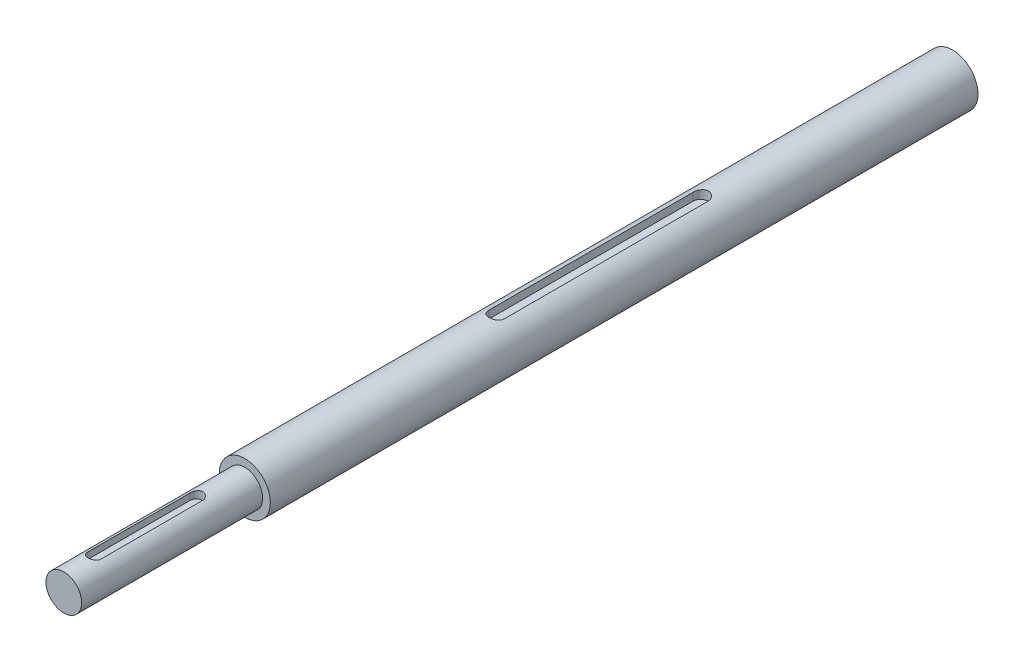
ISO-10303-21;
HEADER;
FILE_DESCRIPTION(('STEP AP214'),'2;1');
FILE_NAME('part.step','',(''),(''),'','','');
FILE_SCHEMA(('AUTOMOTIVE_DESIGN { 1 0 10303 214 1 1 1 1 }'));
ENDSEC;
DATA;
#1=APPLICATION_CONTEXT('core data for automotive mechanical design processes');
#2=APPLICATION_PROTOCOL_DEFINITION('international standard','automotive_design',2000,#1);
#3=PRODUCT_CONTEXT('',#1,'mechanical');
#4=PRODUCT('Part','Part','',(#3));
#5=PRODUCT_RELATED_PRODUCT_CATEGORY('part','',(#4));
#6=PRODUCT_DEFINITION_FORMATION('','',#4);
#7=PRODUCT_DEFINITION_CONTEXT('part definition',#1,'design');
#8=PRODUCT_DEFINITION('design','',#6,#7);
#9=PRODUCT_DEFINITION_SHAPE('','',#8);
#10=(LENGTH_UNIT() NAMED_UNIT(*) SI_UNIT(.MILLI.,.METRE.));
#11=(NAMED_UNIT(*) PLANE_ANGLE_UNIT() SI_UNIT($,.RADIAN.));
#12=(NAMED_UNIT(*) SI_UNIT($,.STERADIAN.) SOLID_ANGLE_UNIT());
#13=UNCERTAINTY_MEASURE_WITH_UNIT(LENGTH_MEASURE(1.E-05),#10,'distance_accuracy_value','');
#14=(GEOMETRIC_REPRESENTATION_CONTEXT(3) GLOBAL_UNCERTAINTY_ASSIGNED_CONTEXT((#13)) GLOBAL_UNIT_ASSIGNED_CONTEXT((#10,
#11,#12)) REPRESENTATION_CONTEXT('',''));
#15=CARTESIAN_POINT('',(0.,0.,0.));
#16=DIRECTION('',(0.,0.,1.));
#17=DIRECTION('',(1.,0.,0.));
#18=AXIS2_PLACEMENT_3D('',#15,#16,#17);
#19=CARTESIAN_POINT('',(0.,0.,138.8));
#20=DIRECTION('',(0.,0.,-1.));
#21=DIRECTION('',(-1.,0.,0.));
#22=AXIS2_PLACEMENT_3D('',#19,#20,#21);
#23=CYLINDRICAL_SURFACE('',#22,10.);
#24=DIRECTION('',(0.,0.,-1.));
#25=VECTOR('',#24,1.);
#26=CARTESIAN_POINT('',(-2.99999999999999,9.53939201416946,138.8));
#27=LINE('',#26,#25);
#28=CARTESIAN_POINT('',(-3.,9.53939201416946,40.));
#29=VERTEX_POINT('',#28);
#30=CARTESIAN_POINT('',(-3.00000000000001,9.53939201416945,-40.));
#31=VERTEX_POINT('',#30);
#32=EDGE_CURVE('E11',#29,#31,#27,.T.);
#33=ORIENTED_EDGE('',*,*,#32,.T.);
#34=CARTESIAN_POINT('',(-3.00000000000001,9.53939201416945,-40.));
#35=CARTESIAN_POINT('',(-3.00001027845729,9.53938054248206,-40.0823355208227));
#36=CARTESIAN_POINT('',(-2.99661062684474,9.54045772064378,-40.1646644550632));
#37=CARTESIAN_POINT('',(-2.98307142899348,9.54470412105985,-40.3286939527655));
#38=CARTESIAN_POINT('',(-2.9729333980542,9.54787287296848,-40.4103946533244));
#39=CARTESIAN_POINT('',(-2.94603140625046,9.55620668351002,-40.5723849156732));
#40=CARTESIAN_POINT('',(-2.92928426957738,9.56136667250114,-40.652677524043));
#41=CARTESIAN_POINT('',(-2.88932853030396,9.57351626651178,-40.8114758441342));
#42=CARTESIAN_POINT('',(-2.86611975872642,9.58050591937827,-40.8899815090674));
#43=CARTESIAN_POINT('',(-2.78708584446026,9.60391637654136,-41.1219493879901));
#44=CARTESIAN_POINT('',(-2.72181852542974,9.6227900783039,-41.272068438833));
#45=CARTESIAN_POINT('',(-2.56815043531277,9.66493213967819,-41.559226043979));
#46=CARTESIAN_POINT('',(-2.47973889924161,9.6882025429064,-41.6962584707622));
#47=CARTESIAN_POINT('',(-2.27929879634444,9.73733650515374,-41.9577229879478));
#48=CARTESIAN_POINT('',(-2.16666914746585,9.76325505469873,-42.0816848740609));
#49=CARTESIAN_POINT('',(-1.92227736150435,9.81429628475076,-42.3092736148388));
#50=CARTESIAN_POINT('',(-1.79051199848165,9.83941883019409,-42.412897033861));
#51=CARTESIAN_POINT('',(-1.50821997465698,9.88666477976534,-42.5989268650946));
#52=CARTESIAN_POINT('',(-1.35736167401017,9.90871541546877,-42.6808501797826));
#53=CARTESIAN_POINT('',(-1.04324233568304,9.94668940088144,-42.8179770040029));
#54=CARTESIAN_POINT('',(-0.879984508687998,9.96261433032402,-42.873187403368));
#55=CARTESIAN_POINT('',(-0.550649404820614,9.98615279768397,-42.953759551791));
#56=CARTESIAN_POINT('',(-0.384786253016216,9.99399098526792,-42.9799297035176));
#57=CARTESIAN_POINT('',(-0.0508471415689416,10.0012640407204,-43.004234695146));
#58=CARTESIAN_POINT('',(0.117228393125325,10.0007004995012,-43.0023748426782));
#59=CARTESIAN_POINT('',(0.44514319927181,9.99139205125586,-42.9712141793086));
#60=CARTESIAN_POINT('',(0.605074290763014,9.98290831016512,-42.9427893091919));
#61=CARTESIAN_POINT('',(0.9177801043703,9.95903027401822,-42.8607367303745));
#62=CARTESIAN_POINT('',(1.07055445110878,9.94363561692558,-42.8071077013173));
#63=CARTESIAN_POINT('',(1.3666956317391,9.90730429851782,-42.6755755564752));
#64=CARTESIAN_POINT('',(1.50993201207611,9.88630511384915,-42.5973967112239));
#65=CARTESIAN_POINT('',(1.78153105916099,9.84099249303647,-42.4192028199656));
#66=CARTESIAN_POINT('',(1.90989038323249,9.81667831471806,-42.3191828810593));
#67=CARTESIAN_POINT('',(2.15330901082204,9.7662334714278,-42.0956160238154));
#68=CARTESIAN_POINT('',(2.26766702955974,9.74006890899097,-41.9713122724738));
#69=CARTESIAN_POINT('',(2.47413538985065,9.68968430229327,-41.7050051531489));
#70=CARTESIAN_POINT('',(2.56623924026179,9.66546482675134,-41.5629966392702));
#71=CARTESIAN_POINT('',(2.726328144817,9.62154457591303,-41.2634381431001));
#72=CARTESIAN_POINT('',(2.79406012682261,9.60189192491895,-41.1057456408129));
#73=CARTESIAN_POINT('',(2.90171772009403,9.56991327306402,-40.7805509920369));
#74=CARTESIAN_POINT('',(2.94168586436071,9.5575760695175,-40.6130642785713));
#75=CARTESIAN_POINT('',(2.97802407180157,9.54628064650012,-40.3700102218596));
#76=CARTESIAN_POINT('',(2.98626405978016,9.54370312550534,-40.2962185316408));
#77=CARTESIAN_POINT('',(2.99724711229707,9.54025857223565,-40.148297041801));
#78=CARTESIAN_POINT('',(2.99999825936536,9.53938902493288,-40.0741679006723));
#79=CARTESIAN_POINT('',(2.99999999999999,9.53939201416946,-40.));
#80=B_SPLINE_CURVE_WITH_KNOTS('',3,(#34,#35,#36,#37,#38,#39,#40,#41,#42,#43,#44,#45,#46,#47,#48,
#49,#50,#51,#52,#53,#54,#55,#56,#57,#58,#59,#60,#61,#62,#63,#64,#65,#66,#67,#68,#69,#70,#71,#72,
#73,#74,#75,#76,#77,#78,#79),.UNSPECIFIED.,.F.,.F.,(4,2,2,2,2,2,2,2,2,2,2,2,2,2,2,2,2,2,2,2,2,2,
4),(0.,0.246918142439474,0.493780777706094,0.74001900962302,0.986263681482027,1.47813347402026,
1.97023245590779,2.47635119822766,2.98255536239032,3.4992281062007,4.01576751791672,
4.51753600864764,5.01920948804101,5.50490358251093,5.99062312360831,6.48200583350621,
6.9734987373917,7.48389234847122,7.99443465298715,8.51013494368214,9.02504345105574,
9.24774267716779,9.47011372732391),.UNSPECIFIED.);
#81=CARTESIAN_POINT('',(2.99999999999999,9.53939201416945,-40.));
#82=VERTEX_POINT('',#81);
#83=EDGE_CURVE('E323',#31,#82,#80,.T.);
#84=ORIENTED_EDGE('',*,*,#83,.T.);
#85=DIRECTION('',(0.,0.,-1.));
#86=VECTOR('',#85,1.);
#87=CARTESIAN_POINT('',(3.00000000000001,9.53939201416945,138.8));
#88=LINE('',#87,#86);
#89=CARTESIAN_POINT('',(3.00000000000001,9.53939201416945,40.));
#90=VERTEX_POINT('',#89);
#91=EDGE_CURVE('E45',#82,#90,#88,.F.);
#92=ORIENTED_EDGE('',*,*,#91,.T.);
#93=CARTESIAN_POINT('',(3.,9.53939201416945,40.));
#94=CARTESIAN_POINT('',(3.00001027845728,9.53938054248206,40.0823355208227));
#95=CARTESIAN_POINT('',(2.99661062684472,9.54045772064378,40.1646644550632));
#96=CARTESIAN_POINT('',(2.98307142899347,9.54470412105986,40.3286939527655));
#97=CARTESIAN_POINT('',(2.97293339805418,9.54787287296848,40.4103946533244));
#98=CARTESIAN_POINT('',(2.94603140625045,9.55620668351003,40.5723849156732));
#99=CARTESIAN_POINT('',(2.92928426957737,9.56136667250114,40.652677524043));
#100=CARTESIAN_POINT('',(2.88932853030395,9.57351626651178,40.8114758441342));
#101=CARTESIAN_POINT('',(2.8661197587264,9.58050591937827,40.8899815090674));
#102=CARTESIAN_POINT('',(2.78708584446024,9.60391637654136,41.1219493879901));
#103=CARTESIAN_POINT('',(2.72181852542972,9.6227900783039,41.272068438833));
#104=CARTESIAN_POINT('',(2.56815043531275,9.66493213967819,41.559226043979));
#105=CARTESIAN_POINT('',(2.47973889924159,9.68820254290641,41.6962584707622));
#106=CARTESIAN_POINT('',(2.27929879634442,9.73733650515374,41.9577229879478));
#107=CARTESIAN_POINT('',(2.16666914746584,9.76325505469874,42.0816848740609));
#108=CARTESIAN_POINT('',(1.92227736150433,9.81429628475077,42.3092736148388));
#109=CARTESIAN_POINT('',(1.79051199848164,9.8394188301941,42.412897033861));
#110=CARTESIAN_POINT('',(1.50821997465697,9.88666477976534,42.5989268650946));
#111=CARTESIAN_POINT('',(1.35736167401016,9.90871541546877,42.6808501797826));
#112=CARTESIAN_POINT('',(1.04324233568303,9.94668940088144,42.8179770040029));
#113=CARTESIAN_POINT('',(0.879984508687983,9.96261433032402,42.873187403368));
#114=CARTESIAN_POINT('',(0.550649404820599,9.98615279768397,42.953759551791));
#115=CARTESIAN_POINT('',(0.384786253016201,9.99399098526792,42.9799297035176));
#116=CARTESIAN_POINT('',(0.0508471415689265,10.0012640407204,43.004234695146));
#117=CARTESIAN_POINT('',(-0.11722839312534,10.0007004995012,43.0023748426782));
#118=CARTESIAN_POINT('',(-0.445143199271825,9.99139205125586,42.9712141793086));
#119=CARTESIAN_POINT('',(-0.605074290763029,9.98290831016512,42.9427893091919));
#120=CARTESIAN_POINT('',(-0.917780104370315,9.95903027401822,42.8607367303745));
#121=CARTESIAN_POINT('',(-1.07055445110879,9.94363561692558,42.8071077013173));
#122=CARTESIAN_POINT('',(-1.36669563173912,9.90730429851782,42.6755755564752));
#123=CARTESIAN_POINT('',(-1.50993201207613,9.88630511384914,42.5973967112239));
#124=CARTESIAN_POINT('',(-1.781531059161,9.84099249303646,42.4192028199656));
#125=CARTESIAN_POINT('',(-1.90989038323251,9.81667831471806,42.3191828810593));
#126=CARTESIAN_POINT('',(-2.15330901082206,9.7662334714278,42.0956160238154));
#127=CARTESIAN_POINT('',(-2.26766702955976,9.74006890899097,41.9713122724738));
#128=CARTESIAN_POINT('',(-2.47413538985067,9.68968430229327,41.7050051531489));
#129=CARTESIAN_POINT('',(-2.5662392402618,9.66546482675133,41.5629966392702));
#130=CARTESIAN_POINT('',(-2.72632814481701,9.62154457591303,41.2634381431001));
#131=CARTESIAN_POINT('',(-2.79406012682263,9.60189192491895,41.1057456408129));
#132=CARTESIAN_POINT('',(-2.90171772009404,9.56991327306402,40.7805509920369));
#133=CARTESIAN_POINT('',(-2.94168586436072,9.55757606951749,40.6130642785713));
#134=CARTESIAN_POINT('',(-2.97802407180159,9.54628064650011,40.3700102218596));
#135=CARTESIAN_POINT('',(-2.98626405978017,9.54370312550533,40.2962185316408));
#136=CARTESIAN_POINT('',(-2.99724711229709,9.54025857223564,40.148297041801));
#137=CARTESIAN_POINT('',(-2.99999825936538,9.53938902493288,40.0741679006723));
#138=CARTESIAN_POINT('',(-3.,9.53939201416945,40.));
#139=B_SPLINE_CURVE_WITH_KNOTS('',3,(#93,#94,#95,#96,#97,#98,#99,#100,#101,#102,#103,#104,#105,
#106,#107,#108,#109,#110,#111,#112,#113,#114,#115,#116,#117,#118,#119,#120,#121,#122,#123,#124,
#125,#126,#127,#128,#129,#130,#131,#132,#133,#134,#135,#136,#137,#138),.UNSPECIFIED.,.F.,.F.,(4,
2,2,2,2,2,2,2,2,2,2,2,2,2,2,2,2,2,2,2,2,2,4),(0.,0.246918142439474,0.493780777706094,
0.74001900962302,0.986263681482027,1.47813347402026,1.97023245590779,2.47635119822766,
2.98255536239032,3.4992281062007,4.01576751791672,4.51753600864764,5.01920948804101,
5.50490358251093,5.99062312360831,6.48200583350621,6.9734987373917,7.48389234847122,
7.99443465298715,8.51013494368214,9.02504345105574,9.24774267716779,9.47011372732391),.UNSPECIFIED.);
#140=EDGE_CURVE('E52',#90,#29,#139,.T.);
#141=ORIENTED_EDGE('',*,*,#140,.T.);
#142=EDGE_LOOP('',(#33,#84,#92,#141));
#143=FACE_BOUND('',#142,.T.);
#144=CARTESIAN_POINT('',(0.,0.,138.8));
#145=DIRECTION('',(0.,0.,1.));
#146=DIRECTION('',(1.,0.,0.));
#147=AXIS2_PLACEMENT_3D('',#144,#145,#146);
#148=CIRCLE('',#147,10.);
#149=CARTESIAN_POINT('',(10.,0.,138.8));
#150=VERTEX_POINT('',#149);
#151=EDGE_CURVE('E164',#150,#150,#148,.T.);
#152=ORIENTED_EDGE('',*,*,#151,.F.);
#153=EDGE_LOOP('',(#152));
#154=FACE_BOUND('',#153,.T.);
#155=CARTESIAN_POINT('',(0.,0.,-138.8));
#156=DIRECTION('',(0.,0.,1.));
#157=DIRECTION('',(1.,0.,0.));
#158=AXIS2_PLACEMENT_3D('',#155,#156,#157);
#159=CIRCLE('',#158,10.);
#160=CARTESIAN_POINT('',(10.,0.,-138.8));
#161=VERTEX_POINT('',#160);
#162=EDGE_CURVE('E159',#161,#161,#159,.T.);
#163=ORIENTED_EDGE('',*,*,#162,.T.);
#164=EDGE_LOOP('',(#163));
#165=FACE_BOUND('',#164,.T.);
#166=ADVANCED_FACE('F37',(#143,#154,#165),#23,.T.);
#167=CARTESIAN_POINT('',(0.,0.,138.8));
#168=DIRECTION('',(0.,0.,1.));
#169=DIRECTION('',(1.,0.,0.));
#170=AXIS2_PLACEMENT_3D('',#167,#168,#169);
#171=PLANE('',#170);
#172=CARTESIAN_POINT('',(0.,0.,138.8));
#173=DIRECTION('',(0.,0.,1.));
#174=DIRECTION('',(1.,0.,0.));
#175=AXIS2_PLACEMENT_3D('',#172,#173,#174);
#176=CIRCLE('',#175,7.);
#177=CARTESIAN_POINT('',(7.,0.,138.8));
#178=VERTEX_POINT('',#177);
#179=EDGE_CURVE('E160',#178,#178,#176,.T.);
#180=ORIENTED_EDGE('',*,*,#179,.F.);
#181=EDGE_LOOP('',(#180));
#182=FACE_BOUND('',#181,.T.);
#183=ORIENTED_EDGE('',*,*,#151,.T.);
#184=EDGE_LOOP('',(#183));
#185=FACE_BOUND('',#184,.T.);
#186=ADVANCED_FACE('F211',(#182,#185),#171,.T.);
#187=CARTESIAN_POINT('',(0.,0.,-138.8));
#188=DIRECTION('',(0.,0.,1.));
#189=DIRECTION('',(1.,0.,0.));
#190=AXIS2_PLACEMENT_3D('',#187,#188,#189);
#191=PLANE('',#190);
#192=ORIENTED_EDGE('',*,*,#162,.F.);
#193=EDGE_LOOP('',(#192));
#194=FACE_BOUND('',#193,.T.);
#195=ADVANCED_FACE('F208',(#194),#191,.F.);
#196=CARTESIAN_POINT('',(0.,0.,209.8));
#197=DIRECTION('',(0.,0.,-1.));
#198=DIRECTION('',(-1.,0.,0.));
#199=AXIS2_PLACEMENT_3D('',#196,#197,#198);
#200=CYLINDRICAL_SURFACE('',#199,7.);
#201=DIRECTION('',(0.,0.,-1.));
#202=VECTOR('',#201,1.);
#203=CARTESIAN_POINT('',(-2.5,6.53834841531101,209.8));
#204=LINE('',#203,#202);
#205=CARTESIAN_POINT('',(-2.5,6.53834841531101,197.8));
#206=VERTEX_POINT('',#205);
#207=CARTESIAN_POINT('',(-2.5,6.53834841531101,157.8));
#208=VERTEX_POINT('',#207);
#209=EDGE_CURVE('E330',#206,#208,#204,.T.);
#210=ORIENTED_EDGE('',*,*,#209,.T.);
#211=CARTESIAN_POINT('',(-2.5,6.53834841531101,157.8));
#212=CARTESIAN_POINT('',(-2.50000932220903,6.53833653785133,157.732110754271));
#213=CARTESIAN_POINT('',(-2.49723485076694,6.53940549922738,157.664228067361));
#214=CARTESIAN_POINT('',(-2.4861910211816,6.54361657478134,157.528996089389));
#215=CARTESIAN_POINT('',(-2.47792334551208,6.54675805418062,157.461646641394));
#216=CARTESIAN_POINT('',(-2.456001752859,6.55501217637942,157.328178585397));
#217=CARTESIAN_POINT('',(-2.44236559963954,6.56011831705676,157.26205666366));
#218=CARTESIAN_POINT('',(-2.40985115466648,6.57213177854175,157.131298164891));
#219=CARTESIAN_POINT('',(-2.39097263107436,6.57903917900746,157.066661653688));
#220=CARTESIAN_POINT('',(-2.32673964179205,6.60214934365709,156.875735633522));
#221=CARTESIAN_POINT('',(-2.27375112606987,6.62075475340844,156.752209547864));
#222=CARTESIAN_POINT('',(-2.14910757865426,6.6622539736071,156.515769666872));
#223=CARTESIAN_POINT('',(-2.0774389504885,6.68515090424876,156.402863683264));
#224=CARTESIAN_POINT('',(-1.9140257110197,6.73379913792224,156.185784786647));
#225=CARTESIAN_POINT('',(-1.82158337146744,6.75962864041371,156.082153524804));
#226=CARTESIAN_POINT('',(-1.62073388776331,6.8105759232303,155.891491295284));
#227=CARTESIAN_POINT('',(-1.51232377552674,6.83569357019868,155.804463420757));
#228=CARTESIAN_POINT('',(-1.27853915335936,6.88331133279046,155.646910144545));
#229=CARTESIAN_POINT('',(-1.15274833789187,6.90570835223796,155.576968478139));
#230=CARTESIAN_POINT('',(-0.890250825476652,6.94442357672633,155.459463353203));
#231=CARTESIAN_POINT('',(-0.753547890540343,6.96074386585465,155.411892220954));
#232=CARTESIAN_POINT('',(-0.47882997925619,6.9849105051071,155.342359397818));
#233=CARTESIAN_POINT('',(-0.341079835227481,6.99306594352515,155.319460869529));
#234=CARTESIAN_POINT('',(-0.0634643052969175,7.00108798053822,155.296931597222));
#235=CARTESIAN_POINT('',(0.0764004845074357,7.00095687302702,155.297294413965));
#236=CARTESIAN_POINT('',(0.347593258486933,6.99262258049077,155.320711273761));
#237=CARTESIAN_POINT('',(0.479022407078707,6.98478243583517,155.342744794199));
#238=CARTESIAN_POINT('',(0.736175812143594,6.96237832507347,155.407173424159));
#239=CARTESIAN_POINT('',(0.861899745780453,6.94781397899037,155.449569684362));
#240=CARTESIAN_POINT('',(1.10616102429806,6.91316506890369,155.554046911565));
#241=CARTESIAN_POINT('',(1.22457279066905,6.89300592164314,155.61639571496));
#242=CARTESIAN_POINT('',(1.44953531305522,6.84923355616321,155.758779335223));
#243=CARTESIAN_POINT('',(1.55608245176769,6.82561928959263,155.838819523784));
#244=CARTESIAN_POINT('',(1.76032445256068,6.7759054780549,156.019323263657));
#245=CARTESIAN_POINT('',(1.85724185700416,6.74974055843876,156.120649723145));
#246=CARTESIAN_POINT('',(2.03299914621295,6.69890342468976,156.338327364166));
#247=CARTESIAN_POINT('',(2.11183255456461,6.67423174765257,156.454683905168));
#248=CARTESIAN_POINT('',(2.25049860898458,6.62877803875405,156.701942598522));
#249=CARTESIAN_POINT('',(2.30994207989624,6.60807875118995,156.833078975505));
#250=CARTESIAN_POINT('',(2.40555439725849,6.57388213610267,157.104364801582));
#251=CARTESIAN_POINT('',(2.44176119399953,6.56037307165054,157.244499141169));
#252=CARTESIAN_POINT('',(2.47705497148627,6.54708542245562,157.455030544264));
#253=CARTESIAN_POINT('',(2.48565347586445,6.54382010967907,157.523736301772));
#254=CARTESIAN_POINT('',(2.49712352174882,6.53944910829676,157.661615164192));
#255=CARTESIAN_POINT('',(2.50000139665368,6.53834103140935,157.7307876671));
#256=CARTESIAN_POINT('',(2.5,6.53834841531101,157.8));
#257=B_SPLINE_CURVE_WITH_KNOTS('',3,(#211,#212,#213,#214,#215,#216,#217,#218,#219,#220,#221,
#222,#223,#224,#225,#226,#227,#228,#229,#230,#231,#232,#233,#234,#235,#236,#237,#238,#239,#240,
#241,#242,#243,#244,#245,#246,#247,#248,#249,#250,#251,#252,#253,#254,#255,#256),.UNSPECIFIED.,
.F.,.F.,(4,2,2,2,2,2,2,2,2,2,2,2,2,2,2,2,2,2,2,2,2,2,4),(0.,0.203591628551585,0.407120929225507,
0.609982356545756,0.812852756635974,1.21793118555509,1.62330528148469,2.04515972311928,
2.46709267811838,2.90188398965559,3.33652604665236,3.7540099394086,4.17137826416921,
4.56998920861346,4.96862268086886,5.37284909448638,5.7771984136792,6.20315837945085,
6.62927065674716,7.06347329058501,7.49696496492443,7.70468580162773,7.91217653896406),.UNSPECIFIED.);
#258=CARTESIAN_POINT('',(2.5,6.53834841531101,157.8));
#259=VERTEX_POINT('',#258);
#260=EDGE_CURVE('E163',#208,#259,#257,.T.);
#261=ORIENTED_EDGE('',*,*,#260,.T.);
#262=DIRECTION('',(0.,0.,-1.));
#263=VECTOR('',#262,1.);
#264=CARTESIAN_POINT('',(2.5,6.53834841531101,209.8));
#265=LINE('',#264,#263);
#266=CARTESIAN_POINT('',(2.5,6.53834841531101,197.8));
#267=VERTEX_POINT('',#266);
#268=EDGE_CURVE('E337',#259,#267,#265,.F.);
#269=ORIENTED_EDGE('',*,*,#268,.T.);
#270=CARTESIAN_POINT('',(2.5,6.53834841531101,197.8));
#271=CARTESIAN_POINT('',(2.50000932220903,6.53833653785133,197.867889245729));
#272=CARTESIAN_POINT('',(2.49723485076694,6.53940549922738,197.935771932639));
#273=CARTESIAN_POINT('',(2.4861910211816,6.54361657478134,198.071003910611));
#274=CARTESIAN_POINT('',(2.47792334551208,6.54675805418062,198.138353358606));
#275=CARTESIAN_POINT('',(2.456001752859,6.55501217637942,198.271821414603));
#276=CARTESIAN_POINT('',(2.44236559963956,6.56011831705676,198.33794333634));
#277=CARTESIAN_POINT('',(2.40985115466649,6.57213177854175,198.468701835108));
#278=CARTESIAN_POINT('',(2.39097263107436,6.57903917900746,198.533338346312));
#279=CARTESIAN_POINT('',(2.32673964179205,6.60214934365709,198.724264366477));
#280=CARTESIAN_POINT('',(2.27375112606987,6.62075475340844,198.847790452136));
#281=CARTESIAN_POINT('',(2.14910757865425,6.6622539736071,199.084230333128));
#282=CARTESIAN_POINT('',(2.07743895048849,6.68515090424876,199.197136316736));
#283=CARTESIAN_POINT('',(1.9140257110197,6.73379913792224,199.414215213353));
#284=CARTESIAN_POINT('',(1.82158337146744,6.75962864041371,199.517846475196));
#285=CARTESIAN_POINT('',(1.62073388776331,6.8105759232303,199.708508704716));
#286=CARTESIAN_POINT('',(1.51232377552674,6.83569357019867,199.795536579243));
#287=CARTESIAN_POINT('',(1.27853915335935,6.88331133279046,199.953089855455));
#288=CARTESIAN_POINT('',(1.15274833789186,6.90570835223796,200.023031521861));
#289=CARTESIAN_POINT('',(0.890250825476645,6.94442357672633,200.140536646797));
#290=CARTESIAN_POINT('',(0.753547890540339,6.96074386585465,200.188107779046));
#291=CARTESIAN_POINT('',(0.478829979256191,6.9849105051071,200.257640602182));
#292=CARTESIAN_POINT('',(0.341079835227483,6.99306594352515,200.280539130471));
#293=CARTESIAN_POINT('',(0.0634643052969189,7.00108798053822,200.303068402778));
#294=CARTESIAN_POINT('',(-0.0764004845074349,7.00095687302702,200.302705586035));
#295=CARTESIAN_POINT('',(-0.347593258486931,6.99262258049077,200.279288726239));
#296=CARTESIAN_POINT('',(-0.479022407078703,6.98478243583517,200.257255205801));
#297=CARTESIAN_POINT('',(-0.736175812143589,6.96237832507347,200.192826575841));
#298=CARTESIAN_POINT('',(-0.861899745780448,6.94781397899037,200.150430315637));
#299=CARTESIAN_POINT('',(-1.10616102429805,6.91316506890369,200.045953088435));
#300=CARTESIAN_POINT('',(-1.22457279066904,6.89300592164314,199.98360428504));
#301=CARTESIAN_POINT('',(-1.44953531305521,6.84923355616321,199.841220664777));
#302=CARTESIAN_POINT('',(-1.55608245176768,6.82561928959264,199.761180476216));
#303=CARTESIAN_POINT('',(-1.76032445256068,6.7759054780549,199.580676736343));
#304=CARTESIAN_POINT('',(-1.85724185700416,6.74974055843876,199.479350276855));
#305=CARTESIAN_POINT('',(-2.03299914621295,6.69890342468976,199.261672635834));
#306=CARTESIAN_POINT('',(-2.11183255456461,6.67423174765257,199.145316094832));
#307=CARTESIAN_POINT('',(-2.25049860898458,6.62877803875405,198.898057401478));
#308=CARTESIAN_POINT('',(-2.30994207989624,6.60807875118995,198.766921024495));
#309=CARTESIAN_POINT('',(-2.40555439725849,6.57388213610267,198.495635198418));
#310=CARTESIAN_POINT('',(-2.44176119399953,6.56037307165054,198.355500858831));
#311=CARTESIAN_POINT('',(-2.47705497148627,6.54708542245562,198.144969455736));
#312=CARTESIAN_POINT('',(-2.48565347586445,6.54382010967907,198.076263698228));
#313=CARTESIAN_POINT('',(-2.49712352174882,6.53944910829676,197.938384835808));
#314=CARTESIAN_POINT('',(-2.50000139665368,6.53834103140935,197.869212332899));
#315=CARTESIAN_POINT('',(-2.5,6.53834841531101,197.8));
#316=B_SPLINE_CURVE_WITH_KNOTS('',3,(#270,#271,#272,#273,#274,#275,#276,#277,#278,#279,#280,
#281,#282,#283,#284,#285,#286,#287,#288,#289,#290,#291,#292,#293,#294,#295,#296,#297,#298,#299,
#300,#301,#302,#303,#304,#305,#306,#307,#308,#309,#310,#311,#312,#313,#314,#315),.UNSPECIFIED.,
.F.,.F.,(4,2,2,2,2,2,2,2,2,2,2,2,2,2,2,2,2,2,2,2,2,2,4),(0.,0.203591628551585,0.407120929225507,
0.60998235654567,0.812852756635974,1.21793118555512,1.62330528148469,2.04515972311927,
2.46709267811838,2.9018839896556,3.33652604665236,3.7540099394086,4.17137826416921,
4.56998920861345,4.96862268086885,5.37284909448636,5.7771984136792,6.20315837945085,
6.62927065674716,7.06347329058501,7.49696496492443,7.70468580162773,7.91217653896406),.UNSPECIFIED.);
#317=EDGE_CURVE('E60',#267,#206,#316,.T.);
#318=ORIENTED_EDGE('',*,*,#317,.T.);
#319=EDGE_LOOP('',(#210,#261,#269,#318));
#320=FACE_BOUND('',#319,.T.);
#321=CARTESIAN_POINT('',(0.,0.,209.8));
#322=DIRECTION('',(0.,0.,1.));
#323=DIRECTION('',(1.,0.,0.));
#324=AXIS2_PLACEMENT_3D('',#321,#322,#323);
#325=CIRCLE('',#324,7.);
#326=CARTESIAN_POINT('',(7.,0.,209.8));
#327=VERTEX_POINT('',#326);
#328=EDGE_CURVE('E149',#327,#327,#325,.T.);
#329=ORIENTED_EDGE('',*,*,#328,.F.);
#330=EDGE_LOOP('',(#329));
#331=FACE_BOUND('',#330,.T.);
#332=ORIENTED_EDGE('',*,*,#179,.T.);
#333=EDGE_LOOP('',(#332));
#334=FACE_BOUND('',#333,.T.);
#335=ADVANCED_FACE('F183',(#320,#331,#334),#200,.T.);
#336=CARTESIAN_POINT('',(0.,0.,209.8));
#337=DIRECTION('',(0.,0.,1.));
#338=DIRECTION('',(1.,0.,0.));
#339=AXIS2_PLACEMENT_3D('',#336,#337,#338);
#340=PLANE('',#339);
#341=ORIENTED_EDGE('',*,*,#328,.T.);
#342=EDGE_LOOP('',(#341));
#343=FACE_BOUND('',#342,.T.);
#344=ADVANCED_FACE('F202',(#343),#340,.T.);
#345=CARTESIAN_POINT('',(0.,4.,197.8));
#346=DIRECTION('',(0.,1.,0.));
#347=DIRECTION('',(0.,0.,1.));
#348=AXIS2_PLACEMENT_3D('',#345,#346,#347);
#349=CYLINDRICAL_SURFACE('',#348,2.5);
#350=DIRECTION('',(0.,1.,0.));
#351=VECTOR('',#350,1.);
#352=CARTESIAN_POINT('',(2.5,4.,197.8));
#353=LINE('',#352,#351);
#354=CARTESIAN_POINT('',(2.5,4.,197.8));
#355=VERTEX_POINT('',#354);
#356=EDGE_CURVE('E146',#355,#267,#353,.T.);
#357=ORIENTED_EDGE('',*,*,#356,.F.);
#358=CARTESIAN_POINT('',(0.,4.,197.8));
#359=DIRECTION('',(0.,1.,0.));
#360=DIRECTION('',(0.,0.,1.));
#361=AXIS2_PLACEMENT_3D('',#358,#359,#360);
#362=CIRCLE('',#361,2.5);
#363=CARTESIAN_POINT('',(-2.5,4.,197.8));
#364=VERTEX_POINT('',#363);
#365=EDGE_CURVE('E130',#364,#355,#362,.T.);
#366=ORIENTED_EDGE('',*,*,#365,.F.);
#367=DIRECTION('',(0.,1.,0.));
#368=VECTOR('',#367,1.);
#369=CARTESIAN_POINT('',(-2.5,4.,197.8));
#370=LINE('',#369,#368);
#371=EDGE_CURVE('E147',#364,#206,#370,.T.);
#372=ORIENTED_EDGE('',*,*,#371,.T.);
#373=ORIENTED_EDGE('',*,*,#317,.F.);
#374=EDGE_LOOP('',(#357,#366,#372,#373));
#375=FACE_BOUND('',#374,.T.);
#376=ADVANCED_FACE('F199',(#375),#349,.F.);
#377=CARTESIAN_POINT('',(-2.5,4.,197.8));
#378=DIRECTION('',(-1.,0.,0.));
#379=DIRECTION('',(0.,0.,1.));
#380=AXIS2_PLACEMENT_3D('',#377,#378,#379);
#381=PLANE('',#380);
#382=ORIENTED_EDGE('',*,*,#371,.F.);
#383=DIRECTION('',(0.,0.,1.));
#384=VECTOR('',#383,1.);
#385=CARTESIAN_POINT('',(-2.5,4.,197.8));
#386=LINE('',#385,#384);
#387=CARTESIAN_POINT('',(-2.5,4.,157.8));
#388=VERTEX_POINT('',#387);
#389=EDGE_CURVE('E143',#388,#364,#386,.T.);
#390=ORIENTED_EDGE('',*,*,#389,.F.);
#391=DIRECTION('',(0.,1.,0.));
#392=VECTOR('',#391,1.);
#393=CARTESIAN_POINT('',(-2.5,4.,157.8));
#394=LINE('',#393,#392);
#395=EDGE_CURVE('E150',#388,#208,#394,.T.);
#396=ORIENTED_EDGE('',*,*,#395,.T.);
#397=ORIENTED_EDGE('',*,*,#209,.F.);
#398=EDGE_LOOP('',(#382,#390,#396,#397));
#399=FACE_BOUND('',#398,.T.);
#400=ADVANCED_FACE('F193',(#399),#381,.F.);
#401=CARTESIAN_POINT('',(0.,4.,157.8));
#402=DIRECTION('',(0.,1.,0.));
#403=DIRECTION('',(0.,0.,1.));
#404=AXIS2_PLACEMENT_3D('',#401,#402,#403);
#405=CYLINDRICAL_SURFACE('',#404,2.5);
#406=ORIENTED_EDGE('',*,*,#395,.F.);
#407=CARTESIAN_POINT('',(0.,4.,157.8));
#408=DIRECTION('',(0.,1.,0.));
#409=DIRECTION('',(0.,0.,1.));
#410=AXIS2_PLACEMENT_3D('',#407,#408,#409);
#411=CIRCLE('',#410,2.5);
#412=CARTESIAN_POINT('',(2.5,4.,157.8));
#413=VERTEX_POINT('',#412);
#414=EDGE_CURVE('E140',#413,#388,#411,.T.);
#415=ORIENTED_EDGE('',*,*,#414,.F.);
#416=DIRECTION('',(0.,1.,0.));
#417=VECTOR('',#416,1.);
#418=CARTESIAN_POINT('',(2.5,4.,157.8));
#419=LINE('',#418,#417);
#420=EDGE_CURVE('E153',#413,#259,#419,.T.);
#421=ORIENTED_EDGE('',*,*,#420,.T.);
#422=ORIENTED_EDGE('',*,*,#260,.F.);
#423=EDGE_LOOP('',(#406,#415,#421,#422));
#424=FACE_BOUND('',#423,.T.);
#425=ADVANCED_FACE('F187',(#424),#405,.F.);
#426=CARTESIAN_POINT('',(2.5,4.,197.8));
#427=DIRECTION('',(1.,0.,0.));
#428=DIRECTION('',(0.,0.,-1.));
#429=AXIS2_PLACEMENT_3D('',#426,#427,#428);
#430=PLANE('',#429);
#431=ORIENTED_EDGE('',*,*,#420,.F.);
#432=DIRECTION('',(0.,0.,-1.));
#433=VECTOR('',#432,1.);
#434=CARTESIAN_POINT('',(2.5,4.,197.8));
#435=LINE('',#434,#433);
#436=EDGE_CURVE('E137',#355,#413,#435,.T.);
#437=ORIENTED_EDGE('',*,*,#436,.F.);
#438=ORIENTED_EDGE('',*,*,#356,.T.);
#439=ORIENTED_EDGE('',*,*,#268,.F.);
#440=EDGE_LOOP('',(#431,#437,#438,#439));
#441=FACE_BOUND('',#440,.T.);
#442=ADVANCED_FACE('F192',(#441),#430,.F.);
#443=CARTESIAN_POINT('',(0.,4.,197.8));
#444=DIRECTION('',(0.,1.,0.));
#445=DIRECTION('',(0.,0.,1.));
#446=AXIS2_PLACEMENT_3D('',#443,#444,#445);
#447=PLANE('',#446);
#448=ORIENTED_EDGE('',*,*,#365,.T.);
#449=ORIENTED_EDGE('',*,*,#436,.T.);
#450=ORIENTED_EDGE('',*,*,#414,.T.);
#451=ORIENTED_EDGE('',*,*,#389,.T.);
#452=EDGE_LOOP('',(#448,#449,#450,#451));
#453=FACE_BOUND('',#452,.T.);
#454=ADVANCED_FACE('F197',(#453),#447,.T.);
#455=CARTESIAN_POINT('',(0.,6.5,40.));
#456=DIRECTION('',(0.,1.,0.));
#457=DIRECTION('',(0.,0.,1.));
#458=AXIS2_PLACEMENT_3D('',#455,#456,#457);
#459=CYLINDRICAL_SURFACE('',#458,3.);
#460=DIRECTION('',(0.,1.,0.));
#461=VECTOR('',#460,1.);
#462=CARTESIAN_POINT('',(3.,6.5,40.));
#463=LINE('',#462,#461);
#464=CARTESIAN_POINT('',(3.,6.5,40.));
#465=VERTEX_POINT('',#464);
#466=EDGE_CURVE('E102',#465,#90,#463,.T.);
#467=ORIENTED_EDGE('',*,*,#466,.F.);
#468=CARTESIAN_POINT('',(0.,6.5,40.));
#469=DIRECTION('',(0.,1.,0.));
#470=DIRECTION('',(0.,0.,1.));
#471=AXIS2_PLACEMENT_3D('',#468,#469,#470);
#472=CIRCLE('',#471,3.);
#473=CARTESIAN_POINT('',(-3.,6.5,40.));
#474=VERTEX_POINT('',#473);
#475=EDGE_CURVE('E106',#474,#465,#472,.T.);
#476=ORIENTED_EDGE('',*,*,#475,.F.);
#477=DIRECTION('',(0.,1.,0.));
#478=VECTOR('',#477,1.);
#479=CARTESIAN_POINT('',(-3.,6.5,40.));
#480=LINE('',#479,#478);
#481=EDGE_CURVE('E128',#474,#29,#480,.T.);
#482=ORIENTED_EDGE('',*,*,#481,.T.);
#483=ORIENTED_EDGE('',*,*,#140,.F.);
#484=EDGE_LOOP('',(#467,#476,#482,#483));
#485=FACE_BOUND('',#484,.T.);
#486=ADVANCED_FACE('F104',(#485),#459,.F.);
#487=CARTESIAN_POINT('',(-3.,6.5,40.));
#488=DIRECTION('',(-1.,0.,0.));
#489=DIRECTION('',(0.,0.,1.));
#490=AXIS2_PLACEMENT_3D('',#487,#488,#489);
#491=PLANE('',#490);
#492=ORIENTED_EDGE('',*,*,#481,.F.);
#493=DIRECTION('',(0.,0.,1.));
#494=VECTOR('',#493,1.);
#495=CARTESIAN_POINT('',(-3.,6.5,40.));
#496=LINE('',#495,#494);
#497=CARTESIAN_POINT('',(-3.00000000000001,6.5,-40.));
#498=VERTEX_POINT('',#497);
#499=EDGE_CURVE('E111',#498,#474,#496,.T.);
#500=ORIENTED_EDGE('',*,*,#499,.F.);
#501=DIRECTION('',(0.,1.,0.));
#502=VECTOR('',#501,1.);
#503=CARTESIAN_POINT('',(-3.00000000000001,6.5,-40.));
#504=LINE('',#503,#502);
#505=EDGE_CURVE('E131',#498,#31,#504,.T.);
#506=ORIENTED_EDGE('',*,*,#505,.T.);
#507=ORIENTED_EDGE('',*,*,#32,.F.);
#508=EDGE_LOOP('',(#492,#500,#506,#507));
#509=FACE_BOUND('',#508,.T.);
#510=ADVANCED_FACE('F282',(#509),#491,.F.);
#511=CARTESIAN_POINT('',(0.,6.5,-40.));
#512=DIRECTION('',(0.,1.,0.));
#513=DIRECTION('',(0.,0.,1.));
#514=AXIS2_PLACEMENT_3D('',#511,#512,#513);
#515=CYLINDRICAL_SURFACE('',#514,3.);
#516=ORIENTED_EDGE('',*,*,#505,.F.);
#517=CARTESIAN_POINT('',(0.,6.5,-40.));
#518=DIRECTION('',(0.,1.,0.));
#519=DIRECTION('',(0.,0.,1.));
#520=AXIS2_PLACEMENT_3D('',#517,#518,#519);
#521=CIRCLE('',#520,3.);
#522=CARTESIAN_POINT('',(2.99999999999999,6.5,-40.));
#523=VERTEX_POINT('',#522);
#524=EDGE_CURVE('E120',#523,#498,#521,.T.);
#525=ORIENTED_EDGE('',*,*,#524,.F.);
#526=DIRECTION('',(0.,1.,0.));
#527=VECTOR('',#526,1.);
#528=CARTESIAN_POINT('',(2.99999999999999,6.5,-40.));
#529=LINE('',#528,#527);
#530=EDGE_CURVE('E110',#523,#82,#529,.T.);
#531=ORIENTED_EDGE('',*,*,#530,.T.);
#532=ORIENTED_EDGE('',*,*,#83,.F.);
#533=EDGE_LOOP('',(#516,#525,#531,#532));
#534=FACE_BOUND('',#533,.T.);
#535=ADVANCED_FACE('F291',(#534),#515,.F.);
#536=CARTESIAN_POINT('',(3.,6.5,40.));
#537=DIRECTION('',(1.,0.,0.));
#538=DIRECTION('',(0.,0.,-1.));
#539=AXIS2_PLACEMENT_3D('',#536,#537,#538);
#540=PLANE('',#539);
#541=ORIENTED_EDGE('',*,*,#530,.F.);
#542=DIRECTION('',(0.,0.,-1.));
#543=VECTOR('',#542,1.);
#544=CARTESIAN_POINT('',(3.,6.5,40.));
#545=LINE('',#544,#543);
#546=EDGE_CURVE('E114',#465,#523,#545,.T.);
#547=ORIENTED_EDGE('',*,*,#546,.F.);
#548=ORIENTED_EDGE('',*,*,#466,.T.);
#549=ORIENTED_EDGE('',*,*,#91,.F.);
#550=EDGE_LOOP('',(#541,#547,#548,#549));
#551=FACE_BOUND('',#550,.T.);
#552=ADVANCED_FACE('F115',(#551),#540,.F.);
#553=CARTESIAN_POINT('',(0.,6.5,40.));
#554=DIRECTION('',(0.,1.,0.));
#555=DIRECTION('',(0.,0.,1.));
#556=AXIS2_PLACEMENT_3D('',#553,#554,#555);
#557=PLANE('',#556);
#558=ORIENTED_EDGE('',*,*,#475,.T.);
#559=ORIENTED_EDGE('',*,*,#546,.T.);
#560=ORIENTED_EDGE('',*,*,#524,.T.);
#561=ORIENTED_EDGE('',*,*,#499,.T.);
#562=EDGE_LOOP('',(#558,#559,#560,#561));
#563=FACE_BOUND('',#562,.T.);
#564=ADVANCED_FACE('F122',(#563),#557,.T.);
#565=CLOSED_SHELL('',(#166,#186,#195,#335,#344,#376,#400,#425,#442,#454,#486,#510,#535,#552,#564));
#566=MANIFOLD_SOLID_BREP('B2',#565);
#567=ADVANCED_BREP_SHAPE_REPRESENTATION('',(#18,#566),#14);
#568=SHAPE_DEFINITION_REPRESENTATION(#9,#567);
ENDSEC;
END-ISO-10303-21;
